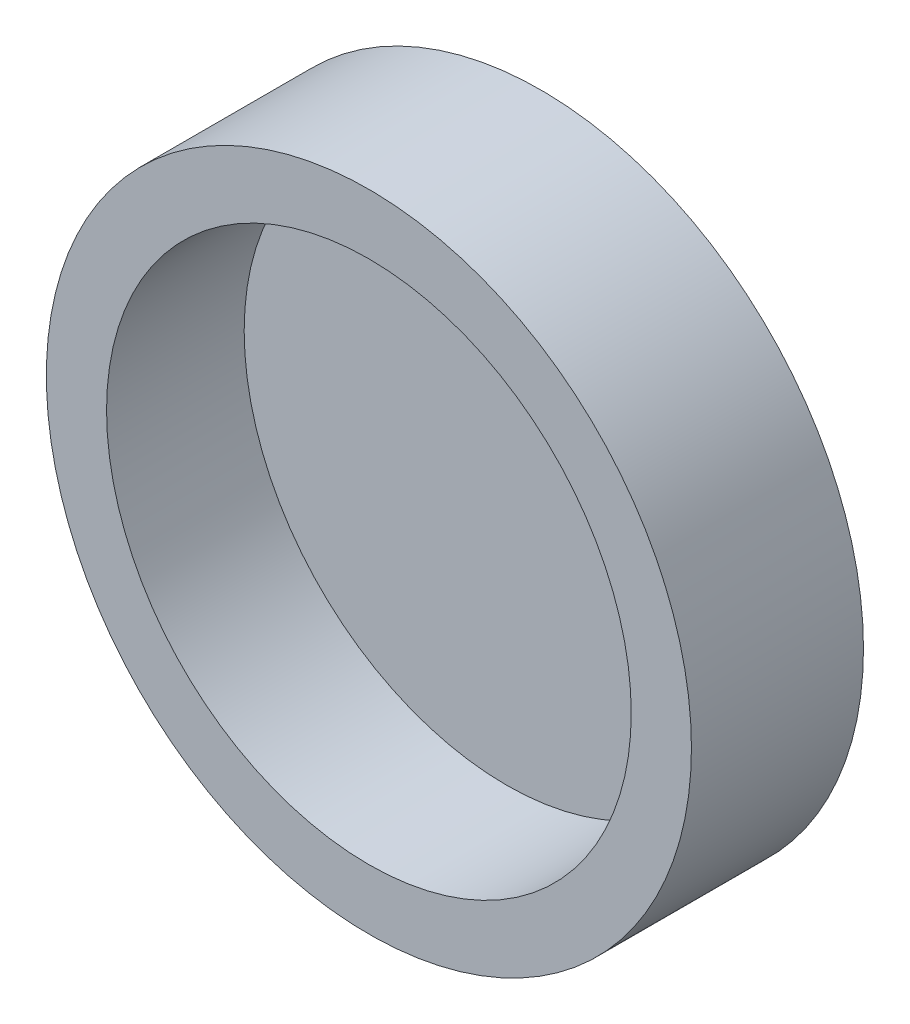
ISO-10303-21;
HEADER;
FILE_DESCRIPTION(('STEP AP214'),'2;1');
FILE_NAME('part.step','',(''),(''),'','','');
FILE_SCHEMA(('AUTOMOTIVE_DESIGN { 1 0 10303 214 1 1 1 1 }'));
ENDSEC;
DATA;
#1=APPLICATION_CONTEXT('core data for automotive mechanical design processes');
#2=APPLICATION_PROTOCOL_DEFINITION('international standard','automotive_design',2000,#1);
#3=PRODUCT_CONTEXT('',#1,'mechanical');
#4=PRODUCT('Part','Part','',(#3));
#5=PRODUCT_RELATED_PRODUCT_CATEGORY('part','',(#4));
#6=PRODUCT_DEFINITION_FORMATION('','',#4);
#7=PRODUCT_DEFINITION_CONTEXT('part definition',#1,'design');
#8=PRODUCT_DEFINITION('design','',#6,#7);
#9=PRODUCT_DEFINITION_SHAPE('','',#8);
#10=(LENGTH_UNIT() NAMED_UNIT(*) SI_UNIT(.MILLI.,.METRE.));
#11=(NAMED_UNIT(*) PLANE_ANGLE_UNIT() SI_UNIT($,.RADIAN.));
#12=(NAMED_UNIT(*) SI_UNIT($,.STERADIAN.) SOLID_ANGLE_UNIT());
#13=UNCERTAINTY_MEASURE_WITH_UNIT(LENGTH_MEASURE(1.E-05),#10,'distance_accuracy_value','');
#14=(GEOMETRIC_REPRESENTATION_CONTEXT(3) GLOBAL_UNCERTAINTY_ASSIGNED_CONTEXT((#13)) GLOBAL_UNIT_ASSIGNED_CONTEXT((#10,
#11,#12)) REPRESENTATION_CONTEXT('',''));
#15=CARTESIAN_POINT('',(0.,0.,0.));
#16=DIRECTION('',(0.,0.,1.));
#17=DIRECTION('',(1.,0.,0.));
#18=AXIS2_PLACEMENT_3D('',#15,#16,#17);
#19=CARTESIAN_POINT('',(0.,0.,4.));
#20=DIRECTION('',(0.,0.,-1.));
#21=DIRECTION('',(-1.,0.,0.));
#22=AXIS2_PLACEMENT_3D('',#19,#20,#21);
#23=CYLINDRICAL_SURFACE('',#22,7.5);
#24=CARTESIAN_POINT('',(0.,0.,4.));
#25=DIRECTION('',(0.,0.,1.));
#26=DIRECTION('',(1.,0.,0.));
#27=AXIS2_PLACEMENT_3D('',#24,#25,#26);
#28=CIRCLE('',#27,7.5);
#29=CARTESIAN_POINT('',(7.5,0.,4.));
#30=VERTEX_POINT('',#29);
#31=EDGE_CURVE('E10',#30,#30,#28,.T.);
#32=ORIENTED_EDGE('',*,*,#31,.F.);
#33=EDGE_LOOP('',(#32));
#34=FACE_BOUND('',#33,.T.);
#35=CARTESIAN_POINT('',(0.,0.,0.));
#36=DIRECTION('',(0.,0.,1.));
#37=DIRECTION('',(1.,0.,0.));
#38=AXIS2_PLACEMENT_3D('',#35,#36,#37);
#39=CIRCLE('',#38,7.5);
#40=CARTESIAN_POINT('',(7.5,0.,0.));
#41=VERTEX_POINT('',#40);
#42=EDGE_CURVE('E46',#41,#41,#39,.T.);
#43=ORIENTED_EDGE('',*,*,#42,.T.);
#44=EDGE_LOOP('',(#43));
#45=FACE_BOUND('',#44,.T.);
#46=ADVANCED_FACE('F43',(#34,#45),#23,.T.);
#47=CARTESIAN_POINT('',(0.,0.,4.));
#48=DIRECTION('',(0.,0.,1.));
#49=DIRECTION('',(1.,0.,0.));
#50=AXIS2_PLACEMENT_3D('',#47,#48,#49);
#51=PLANE('',#50);
#52=CARTESIAN_POINT('',(0.,0.,4.));
#53=DIRECTION('',(0.,0.,1.));
#54=DIRECTION('',(1.,0.,0.));
#55=AXIS2_PLACEMENT_3D('',#52,#53,#54);
#56=CIRCLE('',#55,6.1);
#57=CARTESIAN_POINT('',(6.1,0.,4.));
#58=VERTEX_POINT('',#57);
#59=EDGE_CURVE('E57',#58,#58,#56,.T.);
#60=ORIENTED_EDGE('',*,*,#59,.F.);
#61=EDGE_LOOP('',(#60));
#62=FACE_BOUND('',#61,.T.);
#63=ORIENTED_EDGE('',*,*,#31,.T.);
#64=EDGE_LOOP('',(#63));
#65=FACE_BOUND('',#64,.T.);
#66=ADVANCED_FACE('F74',(#62,#65),#51,.T.);
#67=CARTESIAN_POINT('',(0.,0.,0.));
#68=DIRECTION('',(0.,0.,1.));
#69=DIRECTION('',(1.,0.,0.));
#70=AXIS2_PLACEMENT_3D('',#67,#68,#69);
#71=PLANE('',#70);
#72=ORIENTED_EDGE('',*,*,#42,.F.);
#73=EDGE_LOOP('',(#72));
#74=FACE_BOUND('',#73,.T.);
#75=ADVANCED_FACE('F70',(#74),#71,.F.);
#76=CARTESIAN_POINT('',(0.,0.,0.8));
#77=DIRECTION('',(0.,0.,1.));
#78=DIRECTION('',(1.,0.,0.));
#79=AXIS2_PLACEMENT_3D('',#76,#77,#78);
#80=CYLINDRICAL_SURFACE('',#79,6.1);
#81=CARTESIAN_POINT('',(0.,0.,0.8));
#82=DIRECTION('',(0.,0.,1.));
#83=DIRECTION('',(1.,0.,0.));
#84=AXIS2_PLACEMENT_3D('',#81,#82,#83);
#85=CIRCLE('',#84,6.1);
#86=CARTESIAN_POINT('',(6.1,0.,0.8));
#87=VERTEX_POINT('',#86);
#88=EDGE_CURVE('E55',#87,#87,#85,.T.);
#89=ORIENTED_EDGE('',*,*,#88,.F.);
#90=EDGE_LOOP('',(#89));
#91=FACE_BOUND('',#90,.T.);
#92=ORIENTED_EDGE('',*,*,#59,.T.);
#93=EDGE_LOOP('',(#92));
#94=FACE_BOUND('',#93,.T.);
#95=ADVANCED_FACE('F67',(#91,#94),#80,.F.);
#96=CARTESIAN_POINT('',(0.,0.,0.8));
#97=DIRECTION('',(0.,0.,1.));
#98=DIRECTION('',(1.,0.,0.));
#99=AXIS2_PLACEMENT_3D('',#96,#97,#98);
#100=PLANE('',#99);
#101=ORIENTED_EDGE('',*,*,#88,.T.);
#102=EDGE_LOOP('',(#101));
#103=FACE_BOUND('',#102,.T.);
#104=ADVANCED_FACE('F65',(#103),#100,.T.);
#105=CLOSED_SHELL('',(#46,#66,#75,#95,#104));
#106=MANIFOLD_SOLID_BREP('B2',#105);
#107=ADVANCED_BREP_SHAPE_REPRESENTATION('',(#18,#106),#14);
#108=SHAPE_DEFINITION_REPRESENTATION(#9,#107);
ENDSEC;
END-ISO-10303-21;
